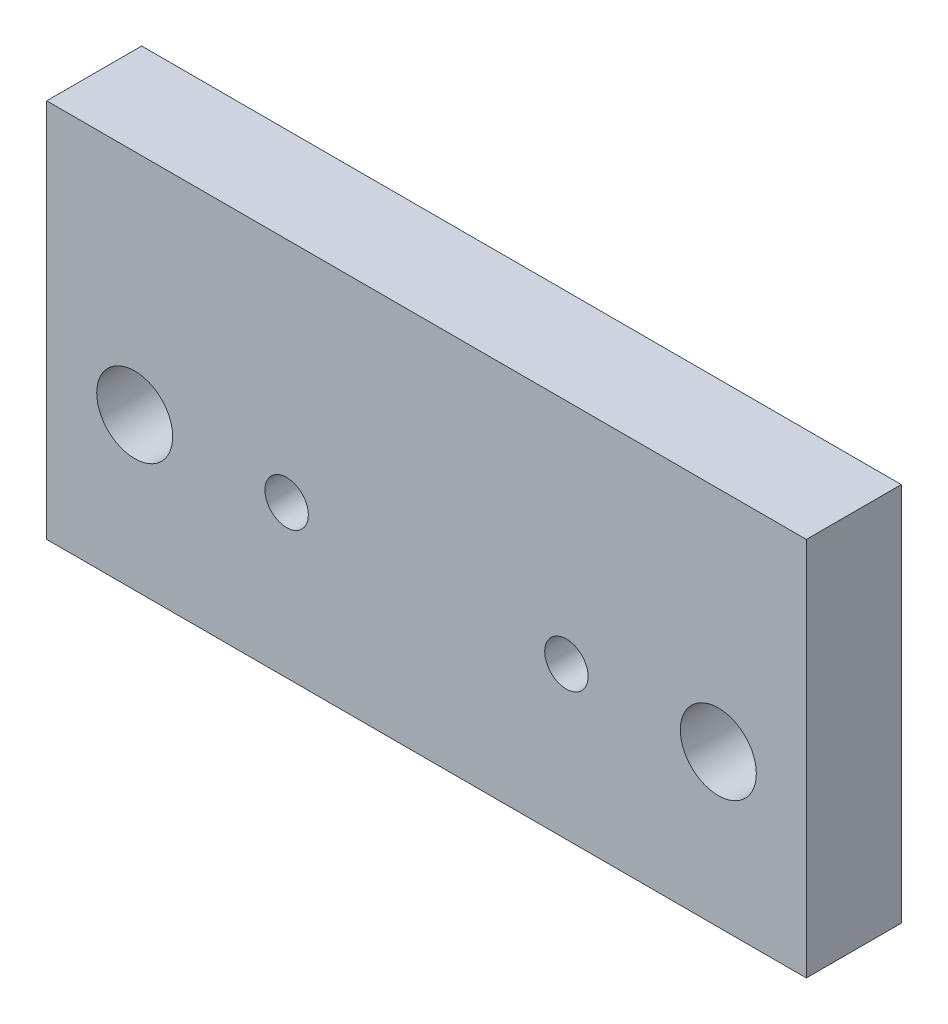
ISO-10303-21;
HEADER;
FILE_DESCRIPTION(('STEP AP214'),'2;1');
FILE_NAME('part.step','',(''),(''),'','','');
FILE_SCHEMA(('AUTOMOTIVE_DESIGN { 1 0 10303 214 1 1 1 1 }'));
ENDSEC;
DATA;
#1=APPLICATION_CONTEXT('core data for automotive mechanical design processes');
#2=APPLICATION_PROTOCOL_DEFINITION('international standard','automotive_design',2000,#1);
#3=PRODUCT_CONTEXT('',#1,'mechanical');
#4=PRODUCT('Part','Part','',(#3));
#5=PRODUCT_RELATED_PRODUCT_CATEGORY('part','',(#4));
#6=PRODUCT_DEFINITION_FORMATION('','',#4);
#7=PRODUCT_DEFINITION_CONTEXT('part definition',#1,'design');
#8=PRODUCT_DEFINITION('design','',#6,#7);
#9=PRODUCT_DEFINITION_SHAPE('','',#8);
#10=(LENGTH_UNIT() NAMED_UNIT(*) SI_UNIT(.MILLI.,.METRE.));
#11=(NAMED_UNIT(*) PLANE_ANGLE_UNIT() SI_UNIT($,.RADIAN.));
#12=(NAMED_UNIT(*) SI_UNIT($,.STERADIAN.) SOLID_ANGLE_UNIT());
#13=UNCERTAINTY_MEASURE_WITH_UNIT(LENGTH_MEASURE(1.E-05),#10,'distance_accuracy_value','');
#14=(GEOMETRIC_REPRESENTATION_CONTEXT(3) GLOBAL_UNCERTAINTY_ASSIGNED_CONTEXT((#13)) GLOBAL_UNIT_ASSIGNED_CONTEXT((#10,
#11,#12)) REPRESENTATION_CONTEXT('',''));
#15=CARTESIAN_POINT('',(0.,0.,0.));
#16=DIRECTION('',(0.,0.,1.));
#17=DIRECTION('',(1.,0.,0.));
#18=AXIS2_PLACEMENT_3D('',#15,#16,#17);
#19=CARTESIAN_POINT('',(-20.,10.,5.));
#20=DIRECTION('',(1.,0.,0.));
#21=DIRECTION('',(0.,1.,0.));
#22=AXIS2_PLACEMENT_3D('',#19,#20,#21);
#23=PLANE('',#22);
#24=DIRECTION('',(0.,-1.,0.));
#25=VECTOR('',#24,1.);
#26=CARTESIAN_POINT('',(-20.,10.,0.));
#27=LINE('',#26,#25);
#28=CARTESIAN_POINT('',(-20.,10.,0.));
#29=VERTEX_POINT('',#28);
#30=CARTESIAN_POINT('',(-20.,-10.,0.));
#31=VERTEX_POINT('',#30);
#32=EDGE_CURVE('E96',#29,#31,#27,.T.);
#33=ORIENTED_EDGE('',*,*,#32,.T.);
#34=DIRECTION('',(0.,0.,-1.));
#35=VECTOR('',#34,1.);
#36=CARTESIAN_POINT('',(-20.,-10.,5.));
#37=LINE('',#36,#35);
#38=CARTESIAN_POINT('',(-20.,-10.,5.));
#39=VERTEX_POINT('',#38);
#40=EDGE_CURVE('E11',#39,#31,#37,.T.);
#41=ORIENTED_EDGE('',*,*,#40,.F.);
#42=DIRECTION('',(0.,-1.,0.));
#43=VECTOR('',#42,1.);
#44=CARTESIAN_POINT('',(-20.,10.,5.));
#45=LINE('',#44,#43);
#46=CARTESIAN_POINT('',(-20.,10.,5.));
#47=VERTEX_POINT('',#46);
#48=EDGE_CURVE('E84',#47,#39,#45,.T.);
#49=ORIENTED_EDGE('',*,*,#48,.F.);
#50=DIRECTION('',(0.,0.,-1.));
#51=VECTOR('',#50,1.);
#52=CARTESIAN_POINT('',(-20.,10.,5.));
#53=LINE('',#52,#51);
#54=EDGE_CURVE('E92',#47,#29,#53,.T.);
#55=ORIENTED_EDGE('',*,*,#54,.T.);
#56=EDGE_LOOP('',(#33,#41,#49,#55));
#57=FACE_BOUND('',#56,.T.);
#58=ADVANCED_FACE('F33',(#57),#23,.F.);
#59=CARTESIAN_POINT('',(-20.,-10.,5.));
#60=DIRECTION('',(0.,1.,0.));
#61=DIRECTION('',(-1.,0.,0.));
#62=AXIS2_PLACEMENT_3D('',#59,#60,#61);
#63=PLANE('',#62);
#64=DIRECTION('',(1.,0.,0.));
#65=VECTOR('',#64,1.);
#66=CARTESIAN_POINT('',(-20.,-10.,0.));
#67=LINE('',#66,#65);
#68=CARTESIAN_POINT('',(20.,-10.,0.));
#69=VERTEX_POINT('',#68);
#70=EDGE_CURVE('E88',#31,#69,#67,.T.);
#71=ORIENTED_EDGE('',*,*,#70,.T.);
#72=DIRECTION('',(0.,0.,-1.));
#73=VECTOR('',#72,1.);
#74=CARTESIAN_POINT('',(20.,-10.,5.));
#75=LINE('',#74,#73);
#76=CARTESIAN_POINT('',(20.,-10.,5.));
#77=VERTEX_POINT('',#76);
#78=EDGE_CURVE('E41',#77,#69,#75,.T.);
#79=ORIENTED_EDGE('',*,*,#78,.F.);
#80=DIRECTION('',(1.,0.,0.));
#81=VECTOR('',#80,1.);
#82=CARTESIAN_POINT('',(-20.,-10.,5.));
#83=LINE('',#82,#81);
#84=EDGE_CURVE('E79',#39,#77,#83,.T.);
#85=ORIENTED_EDGE('',*,*,#84,.F.);
#86=ORIENTED_EDGE('',*,*,#40,.T.);
#87=EDGE_LOOP('',(#71,#79,#85,#86));
#88=FACE_BOUND('',#87,.T.);
#89=ADVANCED_FACE('F87',(#88),#63,.F.);
#90=CARTESIAN_POINT('',(20.,10.,5.));
#91=DIRECTION('',(-1.,0.,0.));
#92=DIRECTION('',(0.,-1.,0.));
#93=AXIS2_PLACEMENT_3D('',#90,#91,#92);
#94=PLANE('',#93);
#95=DIRECTION('',(0.,1.,0.));
#96=VECTOR('',#95,1.);
#97=CARTESIAN_POINT('',(20.,10.,0.));
#98=LINE('',#97,#96);
#99=CARTESIAN_POINT('',(20.,10.,0.));
#100=VERTEX_POINT('',#99);
#101=EDGE_CURVE('E66',#69,#100,#98,.T.);
#102=ORIENTED_EDGE('',*,*,#101,.T.);
#103=DIRECTION('',(0.,0.,-1.));
#104=VECTOR('',#103,1.);
#105=CARTESIAN_POINT('',(20.,10.,5.));
#106=LINE('',#105,#104);
#107=CARTESIAN_POINT('',(20.,10.,5.));
#108=VERTEX_POINT('',#107);
#109=EDGE_CURVE('E89',#108,#100,#106,.T.);
#110=ORIENTED_EDGE('',*,*,#109,.F.);
#111=DIRECTION('',(0.,1.,0.));
#112=VECTOR('',#111,1.);
#113=CARTESIAN_POINT('',(20.,10.,5.));
#114=LINE('',#113,#112);
#115=EDGE_CURVE('E82',#77,#108,#114,.T.);
#116=ORIENTED_EDGE('',*,*,#115,.F.);
#117=ORIENTED_EDGE('',*,*,#78,.T.);
#118=EDGE_LOOP('',(#102,#110,#116,#117));
#119=FACE_BOUND('',#118,.T.);
#120=ADVANCED_FACE('F90',(#119),#94,.F.);
#121=CARTESIAN_POINT('',(-20.,10.,5.));
#122=DIRECTION('',(0.,-1.,0.));
#123=DIRECTION('',(0.,0.,-1.));
#124=AXIS2_PLACEMENT_3D('',#121,#122,#123);
#125=PLANE('',#124);
#126=DIRECTION('',(-1.,0.,0.));
#127=VECTOR('',#126,1.);
#128=CARTESIAN_POINT('',(-20.,10.,0.));
#129=LINE('',#128,#127);
#130=EDGE_CURVE('E72',#100,#29,#129,.T.);
#131=ORIENTED_EDGE('',*,*,#130,.T.);
#132=ORIENTED_EDGE('',*,*,#54,.F.);
#133=DIRECTION('',(-1.,0.,0.));
#134=VECTOR('',#133,1.);
#135=CARTESIAN_POINT('',(-20.,10.,5.));
#136=LINE('',#135,#134);
#137=EDGE_CURVE('E49',#108,#47,#136,.T.);
#138=ORIENTED_EDGE('',*,*,#137,.F.);
#139=ORIENTED_EDGE('',*,*,#109,.T.);
#140=EDGE_LOOP('',(#131,#132,#138,#139));
#141=FACE_BOUND('',#140,.T.);
#142=ADVANCED_FACE('F104',(#141),#125,.F.);
#143=CARTESIAN_POINT('',(0.,0.,5.));
#144=DIRECTION('',(0.,0.,1.));
#145=DIRECTION('',(1.,0.,0.));
#146=AXIS2_PLACEMENT_3D('',#143,#144,#145);
#147=PLANE('',#146);
#148=CARTESIAN_POINT('',(-15.366,-2.,5.));
#149=DIRECTION('',(0.,0.,1.));
#150=DIRECTION('',(1.,0.,0.));
#151=AXIS2_PLACEMENT_3D('',#148,#149,#150);
#152=CIRCLE('',#151,2.);
#153=CARTESIAN_POINT('',(-13.366,-2.,5.));
#154=VERTEX_POINT('',#153);
#155=EDGE_CURVE('E99',#154,#154,#152,.T.);
#156=ORIENTED_EDGE('',*,*,#155,.F.);
#157=EDGE_LOOP('',(#156));
#158=FACE_BOUND('',#157,.T.);
#159=CARTESIAN_POINT('',(15.366,-2.,5.));
#160=DIRECTION('',(0.,0.,1.));
#161=DIRECTION('',(1.,0.,0.));
#162=AXIS2_PLACEMENT_3D('',#159,#160,#161);
#163=CIRCLE('',#162,2.);
#164=CARTESIAN_POINT('',(17.366,-2.,5.));
#165=VERTEX_POINT('',#164);
#166=EDGE_CURVE('E112',#165,#165,#163,.T.);
#167=ORIENTED_EDGE('',*,*,#166,.F.);
#168=EDGE_LOOP('',(#167));
#169=FACE_BOUND('',#168,.T.);
#170=CARTESIAN_POINT('',(7.36599999999998,-2.,5.));
#171=DIRECTION('',(0.,0.,1.));
#172=DIRECTION('',(1.,0.,0.));
#173=AXIS2_PLACEMENT_3D('',#170,#171,#172);
#174=CIRCLE('',#173,1.143);
#175=CARTESIAN_POINT('',(8.50899999999999,-2.,5.));
#176=VERTEX_POINT('',#175);
#177=EDGE_CURVE('E115',#176,#176,#174,.T.);
#178=ORIENTED_EDGE('',*,*,#177,.F.);
#179=EDGE_LOOP('',(#178));
#180=FACE_BOUND('',#179,.T.);
#181=CARTESIAN_POINT('',(-7.36600000000002,-2.,5.));
#182=DIRECTION('',(0.,0.,1.));
#183=DIRECTION('',(1.,0.,0.));
#184=AXIS2_PLACEMENT_3D('',#181,#182,#183);
#185=CIRCLE('',#184,1.143);
#186=CARTESIAN_POINT('',(-6.22300000000002,-2.,5.));
#187=VERTEX_POINT('',#186);
#188=EDGE_CURVE('E118',#187,#187,#185,.T.);
#189=ORIENTED_EDGE('',*,*,#188,.F.);
#190=EDGE_LOOP('',(#189));
#191=FACE_BOUND('',#190,.T.);
#192=ORIENTED_EDGE('',*,*,#48,.T.);
#193=ORIENTED_EDGE('',*,*,#84,.T.);
#194=ORIENTED_EDGE('',*,*,#115,.T.);
#195=ORIENTED_EDGE('',*,*,#137,.T.);
#196=EDGE_LOOP('',(#192,#193,#194,#195));
#197=FACE_BOUND('',#196,.T.);
#198=ADVANCED_FACE('F80',(#158,#169,#180,#191,#197),#147,.T.);
#199=CARTESIAN_POINT('',(0.,0.,0.));
#200=DIRECTION('',(0.,0.,1.));
#201=DIRECTION('',(1.,0.,0.));
#202=AXIS2_PLACEMENT_3D('',#199,#200,#201);
#203=PLANE('',#202);
#204=CARTESIAN_POINT('',(-15.366,-2.,0.));
#205=DIRECTION('',(0.,0.,-1.));
#206=DIRECTION('',(-1.,0.,0.));
#207=AXIS2_PLACEMENT_3D('',#204,#205,#206);
#208=CIRCLE('',#207,2.);
#209=CARTESIAN_POINT('',(-17.366,-2.,0.));
#210=VERTEX_POINT('',#209);
#211=EDGE_CURVE('E125',#210,#210,#208,.T.);
#212=ORIENTED_EDGE('',*,*,#211,.F.);
#213=EDGE_LOOP('',(#212));
#214=FACE_BOUND('',#213,.T.);
#215=CARTESIAN_POINT('',(15.366,-2.,0.));
#216=DIRECTION('',(0.,0.,-1.));
#217=DIRECTION('',(-1.,0.,0.));
#218=AXIS2_PLACEMENT_3D('',#215,#216,#217);
#219=CIRCLE('',#218,2.);
#220=CARTESIAN_POINT('',(13.366,-2.,0.));
#221=VERTEX_POINT('',#220);
#222=EDGE_CURVE('E128',#221,#221,#219,.T.);
#223=ORIENTED_EDGE('',*,*,#222,.F.);
#224=EDGE_LOOP('',(#223));
#225=FACE_BOUND('',#224,.T.);
#226=CARTESIAN_POINT('',(7.36599999999998,-2.,0.));
#227=DIRECTION('',(0.,0.,-1.));
#228=DIRECTION('',(-1.,0.,0.));
#229=AXIS2_PLACEMENT_3D('',#226,#227,#228);
#230=CIRCLE('',#229,1.143);
#231=CARTESIAN_POINT('',(6.22299999999998,-2.,0.));
#232=VERTEX_POINT('',#231);
#233=EDGE_CURVE('E124',#232,#232,#230,.T.);
#234=ORIENTED_EDGE('',*,*,#233,.F.);
#235=EDGE_LOOP('',(#234));
#236=FACE_BOUND('',#235,.T.);
#237=CARTESIAN_POINT('',(-7.36600000000002,-2.,0.));
#238=DIRECTION('',(0.,0.,-1.));
#239=DIRECTION('',(-1.,0.,0.));
#240=AXIS2_PLACEMENT_3D('',#237,#238,#239);
#241=CIRCLE('',#240,1.143);
#242=CARTESIAN_POINT('',(-8.50900000000001,-2.,0.));
#243=VERTEX_POINT('',#242);
#244=EDGE_CURVE('E121',#243,#243,#241,.T.);
#245=ORIENTED_EDGE('',*,*,#244,.F.);
#246=EDGE_LOOP('',(#245));
#247=FACE_BOUND('',#246,.T.);
#248=ORIENTED_EDGE('',*,*,#32,.F.);
#249=ORIENTED_EDGE('',*,*,#130,.F.);
#250=ORIENTED_EDGE('',*,*,#101,.F.);
#251=ORIENTED_EDGE('',*,*,#70,.F.);
#252=EDGE_LOOP('',(#248,#249,#250,#251));
#253=FACE_BOUND('',#252,.T.);
#254=ADVANCED_FACE('F107',(#214,#225,#236,#247,#253),#203,.F.);
#255=CARTESIAN_POINT('',(-7.36600000000002,-2.,10.));
#256=DIRECTION('',(0.,0.,-1.));
#257=DIRECTION('',(-1.,0.,0.));
#258=AXIS2_PLACEMENT_3D('',#255,#256,#257);
#259=CYLINDRICAL_SURFACE('',#258,1.143);
#260=ORIENTED_EDGE('',*,*,#188,.T.);
#261=EDGE_LOOP('',(#260));
#262=FACE_BOUND('',#261,.T.);
#263=ORIENTED_EDGE('',*,*,#244,.T.);
#264=EDGE_LOOP('',(#263));
#265=FACE_BOUND('',#264,.T.);
#266=ADVANCED_FACE('F138',(#262,#265),#259,.F.);
#267=CARTESIAN_POINT('',(7.36599999999998,-2.,10.));
#268=DIRECTION('',(0.,0.,-1.));
#269=DIRECTION('',(-1.,0.,0.));
#270=AXIS2_PLACEMENT_3D('',#267,#268,#269);
#271=CYLINDRICAL_SURFACE('',#270,1.143);
#272=ORIENTED_EDGE('',*,*,#177,.T.);
#273=EDGE_LOOP('',(#272));
#274=FACE_BOUND('',#273,.T.);
#275=ORIENTED_EDGE('',*,*,#233,.T.);
#276=EDGE_LOOP('',(#275));
#277=FACE_BOUND('',#276,.T.);
#278=ADVANCED_FACE('F134',(#274,#277),#271,.F.);
#279=CARTESIAN_POINT('',(15.366,-2.,10.));
#280=DIRECTION('',(0.,0.,-1.));
#281=DIRECTION('',(-1.,0.,0.));
#282=AXIS2_PLACEMENT_3D('',#279,#280,#281);
#283=CYLINDRICAL_SURFACE('',#282,2.);
#284=ORIENTED_EDGE('',*,*,#166,.T.);
#285=EDGE_LOOP('',(#284));
#286=FACE_BOUND('',#285,.T.);
#287=ORIENTED_EDGE('',*,*,#222,.T.);
#288=EDGE_LOOP('',(#287));
#289=FACE_BOUND('',#288,.T.);
#290=ADVANCED_FACE('F149',(#286,#289),#283,.F.);
#291=CARTESIAN_POINT('',(-15.366,-2.,10.));
#292=DIRECTION('',(0.,0.,-1.));
#293=DIRECTION('',(-1.,0.,0.));
#294=AXIS2_PLACEMENT_3D('',#291,#292,#293);
#295=CYLINDRICAL_SURFACE('',#294,2.);
#296=ORIENTED_EDGE('',*,*,#155,.T.);
#297=EDGE_LOOP('',(#296));
#298=FACE_BOUND('',#297,.T.);
#299=ORIENTED_EDGE('',*,*,#211,.T.);
#300=EDGE_LOOP('',(#299));
#301=FACE_BOUND('',#300,.T.);
#302=ADVANCED_FACE('F178',(#298,#301),#295,.F.);
#303=CLOSED_SHELL('',(#58,#89,#120,#142,#198,#254,#266,#278,#290,#302));
#304=MANIFOLD_SOLID_BREP('B2',#303);
#305=ADVANCED_BREP_SHAPE_REPRESENTATION('',(#18,#304),#14);
#306=SHAPE_DEFINITION_REPRESENTATION(#9,#305);
ENDSEC;
END-ISO-10303-21;
